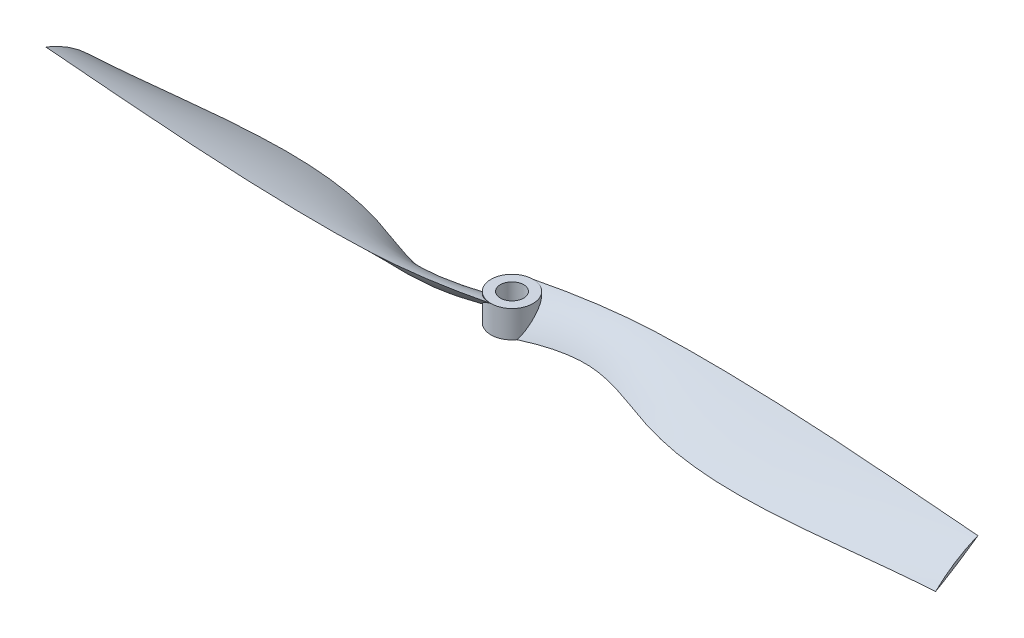
ISO-10303-21;
HEADER;
FILE_DESCRIPTION(('STEP AP214'),'2;1');
FILE_NAME('part.step','',(''),(''),'','','');
FILE_SCHEMA(('AUTOMOTIVE_DESIGN { 1 0 10303 214 1 1 1 1 }'));
ENDSEC;
DATA;
#1=APPLICATION_CONTEXT('core data for automotive mechanical design processes');
#2=APPLICATION_PROTOCOL_DEFINITION('international standard','automotive_design',2000,#1);
#3=PRODUCT_CONTEXT('',#1,'mechanical');
#4=PRODUCT('Part','Part','',(#3));
#5=PRODUCT_RELATED_PRODUCT_CATEGORY('part','',(#4));
#6=PRODUCT_DEFINITION_FORMATION('','',#4);
#7=PRODUCT_DEFINITION_CONTEXT('part definition',#1,'design');
#8=PRODUCT_DEFINITION('design','',#6,#7);
#9=PRODUCT_DEFINITION_SHAPE('','',#8);
#10=(LENGTH_UNIT() NAMED_UNIT(*) SI_UNIT(.MILLI.,.METRE.));
#11=(NAMED_UNIT(*) PLANE_ANGLE_UNIT() SI_UNIT($,.RADIAN.));
#12=(NAMED_UNIT(*) SI_UNIT($,.STERADIAN.) SOLID_ANGLE_UNIT());
#13=UNCERTAINTY_MEASURE_WITH_UNIT(LENGTH_MEASURE(1.E-05),#10,'distance_accuracy_value','');
#14=(GEOMETRIC_REPRESENTATION_CONTEXT(3) GLOBAL_UNCERTAINTY_ASSIGNED_CONTEXT((#13)) GLOBAL_UNIT_ASSIGNED_CONTEXT((#10,
#11,#12)) REPRESENTATION_CONTEXT('',''));
#15=CARTESIAN_POINT('',(0.,0.,0.));
#16=DIRECTION('',(0.,0.,1.));
#17=DIRECTION('',(1.,0.,0.));
#18=AXIS2_PLACEMENT_3D('',#15,#16,#17);
#19=CARTESIAN_POINT('',(0.,3.5,0.));
#20=DIRECTION('',(0.,-1.,0.));
#21=DIRECTION('',(0.,0.,-1.));
#22=AXIS2_PLACEMENT_3D('',#19,#20,#21);
#23=CYLINDRICAL_SURFACE('',#22,5.4);
#24=CARTESIAN_POINT('',(0.,-3.5,0.));
#25=DIRECTION('',(0.,1.,0.));
#26=DIRECTION('',(0.,0.,1.));
#27=AXIS2_PLACEMENT_3D('',#24,#25,#26);
#28=CIRCLE('',#27,5.4);
#29=CARTESIAN_POINT('',(-4.41918488795275,-3.5,-3.10335381903032));
#30=VERTEX_POINT('',#29);
#31=CARTESIAN_POINT('',(4.41918488795275,-3.5,3.10335381903031));
#32=VERTEX_POINT('',#31);
#33=EDGE_CURVE('E46',#30,#32,#28,.T.);
#34=ORIENTED_EDGE('',*,*,#33,.T.);
#35=CARTESIAN_POINT('',(4.41918488795275,-3.5,3.10335381903031));
#36=CARTESIAN_POINT('',(4.4604101205426,-3.43336748555602,3.04463457339622));
#37=CARTESIAN_POINT('',(4.49995846699868,-3.36578298014479,2.98584372432226));
#38=CARTESIAN_POINT('',(4.57593298451117,-3.22908420219905,2.8680604736539));
#39=CARTESIAN_POINT('',(4.61235993128859,-3.15997031514549,2.80906812594708));
#40=CARTESIAN_POINT('',(4.68230721528959,-3.02062581289679,2.69085575102085));
#41=CARTESIAN_POINT('',(4.71583053187688,-2.95039643202226,2.63163602388557));
#42=CARTESIAN_POINT('',(4.78019385419825,-2.80902040625091,2.5128290464834));
#43=CARTESIAN_POINT('',(4.81103366565276,-2.73787369536897,2.45324176994067));
#44=CARTESIAN_POINT('',(4.89975270183403,-2.52342323465822,2.27381888546016));
#45=CARTESIAN_POINT('',(4.95383722043105,-2.37909763224323,2.15331254015121));
#46=CARTESIAN_POINT('',(5.05327102292177,-2.08742649649282,1.90843425378151));
#47=CARTESIAN_POINT('',(5.09850202303885,-1.94006580294201,1.78403276805937));
#48=CARTESIAN_POINT('',(5.17973512502874,-1.64527854687953,1.53226654406895));
#49=CARTESIAN_POINT('',(5.21573546181043,-1.497851977162,1.4049012441302));
#50=CARTESIAN_POINT('',(5.27849757504177,-1.20400289573401,1.14677917638062));
#51=CARTESIAN_POINT('',(5.30525976370166,-1.05758033950984,1.0160225601718));
#52=CARTESIAN_POINT('',(5.34500844938,-0.794713712130156,0.776311392217463));
#53=CARTESIAN_POINT('',(5.35965529157521,-0.677926410094922,0.668007192208229));
#54=CARTESIAN_POINT('',(5.38244064587051,-0.446153633908864,0.44885218603844));
#55=CARTESIAN_POINT('',(5.39058052545951,-0.331167786151019,0.338001919993733));
#56=CARTESIAN_POINT('',(5.39997087143736,-0.103474124334729,0.113662281433424));
#57=CARTESIAN_POINT('',(5.40122053020611,0.00923342113563584,0.000172601110973725));
#58=CARTESIAN_POINT('',(5.3963562325174,0.231372969271267,-0.228943824431259));
#59=CARTESIAN_POINT('',(5.39027191445537,0.34081633653269,-0.344560121026047));
#60=CARTESIAN_POINT('',(5.37023254254186,0.556334416177986,-0.578231204856332));
#61=CARTESIAN_POINT('',(5.35627791271847,0.662409309719615,-0.6962858603905));
#62=CARTESIAN_POINT('',(5.31988434267454,0.870571259905385,-0.934529732756379));
#63=CARTESIAN_POINT('',(5.29744822086196,0.972659628855704,-1.05471822788076));
#64=CARTESIAN_POINT('',(5.24157542923348,1.17913638561014,-1.30516584865122));
#65=CARTESIAN_POINT('',(5.20748874914385,1.28320071605499,-1.43554944052338));
#66=CARTESIAN_POINT('',(5.1280731962804,1.48533803238795,-1.69752561079259));
#67=CARTESIAN_POINT('',(5.08274609500762,1.58341195933674,-1.8291179955388));
#68=CARTESIAN_POINT('',(4.9801185798928,1.77282036498426,-2.09245752188393));
#69=CARTESIAN_POINT('',(4.92282140823335,1.86415665957499,-2.22420461199087));
#70=CARTESIAN_POINT('',(4.79564722930201,2.03944797549757,-2.48656680478274));
#71=CARTESIAN_POINT('',(4.72577003773041,2.12340288866394,-2.6171818908542));
#72=CARTESIAN_POINT('',(4.57239059400412,2.28409217554873,-2.87683399040516));
#73=CARTESIAN_POINT('',(4.48877382725152,2.36075648925887,-3.00584699408273));
#74=CARTESIAN_POINT('',(4.3082829669153,2.50565787314958,-3.25927804537541));
#75=CARTESIAN_POINT('',(4.21140869040465,2.57389482702476,-3.38369602955839));
#76=CARTESIAN_POINT('',(4.00472349038269,2.70179988650986,-3.62595246318709));
#77=CARTESIAN_POINT('',(3.89491692215641,2.76147086199874,-3.74379310812854));
#78=CARTESIAN_POINT('',(3.66299135971123,2.87241100831602,-3.9709993327217));
#79=CARTESIAN_POINT('',(3.54087392623822,2.92368124201475,-4.08036598358731));
#80=CARTESIAN_POINT('',(3.30190582637324,3.01207825343128,-4.27527999114959));
#81=CARTESIAN_POINT('',(3.1864286414865,3.05017703832275,-4.36207653585006));
#82=CARTESIAN_POINT('',(2.94769340457762,3.12070261273306,-4.52682366183866));
#83=CARTESIAN_POINT('',(2.82443561765341,3.15312959535774,-4.60477454426017));
#84=CARTESIAN_POINT('',(2.57100675080269,3.2127862068235,-4.75092968656728));
#85=CARTESIAN_POINT('',(2.44083280781373,3.24001366146174,-4.81912986617584));
#86=CARTESIAN_POINT('',(2.17461880015893,3.28976437303129,-4.94496796488434));
#87=CARTESIAN_POINT('',(2.03857891213785,3.31228777149951,-5.00260620176846));
#88=CARTESIAN_POINT('',(1.76582131322648,3.35254003145319,-5.10514123502791));
#89=CARTESIAN_POINT('',(1.62924528877539,3.37039203459072,-5.15036725871229));
#90=CARTESIAN_POINT('',(1.35254061164642,3.40261652940536,-5.22985204745642));
#91=CARTESIAN_POINT('',(1.21241205799715,3.41698911795541,-5.26411111786373));
#92=CARTESIAN_POINT('',(0.929871040065975,3.44265063570142,-5.32128557677752));
#93=CARTESIAN_POINT('',(0.787463421555018,3.45394537247775,-5.34422239650218));
#94=CARTESIAN_POINT('',(0.501144485650809,3.47384998832177,-5.37862655698535));
#95=CARTESIAN_POINT('',(0.357234118489247,3.48246146904569,-5.39010074893402));
#96=CARTESIAN_POINT('',(0.177579717990571,3.49171214991471,-5.39719651976856));
#97=CARTESIAN_POINT('',(0.142059328174401,3.49346826416285,-5.39824816313132));
#98=CARTESIAN_POINT('',(0.0710279621018893,3.4968388349927,-5.39964949380082));
#99=CARTESIAN_POINT('',(0.0355170030915233,3.49845340957628,-5.39999977126331));
#100=CARTESIAN_POINT('',(0.,3.5,-5.4));
#101=B_SPLINE_CURVE_WITH_KNOTS('',3,(#35,#36,#37,#38,#39,#40,#41,#42,#43,#44,#45,#46,#47,#48,
#49,#50,#51,#52,#53,#54,#55,#56,#57,#58,#59,#60,#61,#62,#63,#64,#65,#66,#67,#68,#69,#70,#71,#72,
#73,#74,#75,#76,#77,#78,#79,#80,#81,#82,#83,#84,#85,#86,#87,#88,#89,#90,#91,#92,#93,#94,#95,#96,
#97,#98,#99,#100),.UNSPECIFIED.,.F.,.F.,(4,2,2,2,2,2,2,2,2,2,2,2,2,2,2,2,2,2,2,2,2,2,2,2,2,2,2,
2,2,2,2,2,4),(0.,0.29370396488851,0.587334726359795,0.880660538229285,1.17400756856857,
1.76065341963551,2.3546697046551,2.94879949313682,3.54290276785765,4.02260163666692,
4.50219966649728,4.98185391002378,5.45957623483793,5.93727282390774,6.41481081327993,
6.92516556422428,7.43543993383626,7.94557627061862,8.45572008160494,8.9703542016417,
9.48499542331291,9.99946381914954,10.5138670735807,10.9615072373095,11.4091321574246,
11.8569438457403,12.3047420582359,12.7391613454514,13.1735685362886,13.6071502799418,
14.0404727173076,14.1472065870339,14.2538506090473),.UNSPECIFIED.);
#102=CARTESIAN_POINT('',(0.,3.5,-5.4));
#103=VERTEX_POINT('',#102);
#104=EDGE_CURVE('E59',#32,#103,#101,.T.);
#105=ORIENTED_EDGE('',*,*,#104,.T.);
#106=CARTESIAN_POINT('',(0.,3.5,0.));
#107=DIRECTION('',(0.,1.,0.));
#108=DIRECTION('',(0.,0.,1.));
#109=AXIS2_PLACEMENT_3D('',#106,#107,#108);
#110=CIRCLE('',#109,5.4);
#111=CARTESIAN_POINT('',(0.,3.5,5.4));
#112=VERTEX_POINT('',#111);
#113=EDGE_CURVE('E11',#112,#103,#110,.T.);
#114=ORIENTED_EDGE('',*,*,#113,.F.);
#115=CARTESIAN_POINT('',(0.,3.5,5.4));
#116=CARTESIAN_POINT('',(-0.0707902295039716,3.48091702945953,5.40000109805365));
#117=CARTESIAN_POINT('',(-0.141167622617572,3.46037823160796,5.39860778788969));
#118=CARTESIAN_POINT('',(-0.280931878348902,3.41654901950545,5.39314054188027));
#119=CARTESIAN_POINT('',(-0.350319045091694,3.3932594713964,5.38906744799466));
#120=CARTESIAN_POINT('',(-0.55643275534332,3.31962155093008,5.37301902993027));
#121=CARTESIAN_POINT('',(-0.691505479413642,3.2653963793861,5.35721334184325));
#122=CARTESIAN_POINT('',(-0.954339808268309,3.14889621106557,5.31664239584639));
#123=CARTESIAN_POINT('',(-1.08217767545191,3.08674557784695,5.29200668925314));
#124=CARTESIAN_POINT('',(-1.33224279543914,2.95513606909263,5.23465345548202));
#125=CARTESIAN_POINT('',(-1.45446563898028,2.88567158654987,5.20192970149599));
#126=CARTESIAN_POINT('',(-1.73027499621123,2.71813264568398,5.11790298694128));
#127=CARTESIAN_POINT('',(-1.88174962489398,2.6178937236479,5.06398876230656));
#128=CARTESIAN_POINT('',(-2.1746890016931,2.40963309035633,4.94527223319639));
#129=CARTESIAN_POINT('',(-2.31615190239814,2.30160995010349,4.8804679266375));
#130=CARTESIAN_POINT('',(-2.59044115098279,2.07904362874885,4.74062067335338));
#131=CARTESIAN_POINT('',(-2.7231966296543,1.96445847693813,4.66550619167144));
#132=CARTESIAN_POINT('',(-2.97934948615688,1.73123315179934,4.50624215839688));
#133=CARTESIAN_POINT('',(-3.10274650031725,1.61259282114631,4.42209225599373));
#134=CARTESIAN_POINT('',(-3.38127798605231,1.33160672809383,4.21503758052774));
#135=CARTESIAN_POINT('',(-3.53282078563181,1.16819951072278,4.08872574977455));
#136=CARTESIAN_POINT('',(-3.82025605507577,0.839467722250604,3.82153726591543));
#137=CARTESIAN_POINT('',(-3.95614310113484,0.674142508378459,3.68065559709503));
#138=CARTESIAN_POINT('',(-4.21190488724998,0.344339241063858,3.38496484520181));
#139=CARTESIAN_POINT('',(-4.3318108798632,0.179860157382653,3.23018396648045));
#140=CARTESIAN_POINT('',(-4.55522959925532,-0.146383314491664,2.90663210844121));
#141=CARTESIAN_POINT('',(-4.65874773180061,-0.308148582067612,2.73786577052661));
#142=CARTESIAN_POINT('',(-4.82965740623026,-0.595847011263494,2.42078599363901));
#143=CARTESIAN_POINT('',(-4.90015738425229,-0.722616488700892,2.27490128067798));
#144=CARTESIAN_POINT('',(-5.02876920882638,-0.972045346569741,1.97438297784407));
#145=CARTESIAN_POINT('',(-5.08688151747308,-1.09470488016966,1.81974971458893));
#146=CARTESIAN_POINT('',(-5.1894730940954,-1.33469060351921,1.50237851220533));
#147=CARTESIAN_POINT('',(-5.23397094883835,-1.45202387661838,1.33965197847006));
#148=CARTESIAN_POINT('',(-5.30808784670011,-1.68048424053199,1.00662088720331));
#149=CARTESIAN_POINT('',(-5.33770982280593,-1.79161255089796,0.836317830702867));
#150=CARTESIAN_POINT('',(-5.37670042602779,-1.98694681492127,0.521046962638232));
#151=CARTESIAN_POINT('',(-5.38878603645914,-2.07235412814554,0.377156443973048));
#152=CARTESIAN_POINT('',(-5.40128428645354,-2.23785078255383,0.0858580594322358));
#153=CARTESIAN_POINT('',(-5.40169887655849,-2.31794101013392,-0.0615492145773195));
#154=CARTESIAN_POINT('',(-5.39011096712508,-2.47239269525534,-0.358974627887704));
#155=CARTESIAN_POINT('',(-5.37810171725548,-2.54675101483997,-0.508994142950934));
#156=CARTESIAN_POINT('',(-5.34100796798822,-2.68929315131044,-0.810357044734655));
#157=CARTESIAN_POINT('',(-5.31592384974578,-2.75747714812056,-0.96170039273666));
#158=CARTESIAN_POINT('',(-5.25194706015455,-2.88782998309472,-1.26542907461458));
#159=CARTESIAN_POINT('',(-5.21295528850531,-2.94995146758674,-1.4178139815267));
#160=CARTESIAN_POINT('',(-5.12088341065518,-3.06737523721989,-1.72094018891239));
#161=CARTESIAN_POINT('',(-5.06780511261347,-3.12267839623401,-1.87168169775046));
#162=CARTESIAN_POINT('',(-4.94762682821785,-3.22620858701941,-2.16949673958286));
#163=CARTESIAN_POINT('',(-4.88056148246025,-3.27445260850568,-2.31657834790367));
#164=CARTESIAN_POINT('',(-4.73252287007731,-3.36394839581921,-2.60567817568683));
#165=CARTESIAN_POINT('',(-4.65156162019338,-3.4052061424228,-2.74770064305268));
#166=CARTESIAN_POINT('',(-4.54069573038565,-3.45297176619784,-2.9230071474527));
#167=CARTESIAN_POINT('',(-4.51703167385927,-3.46272093378846,-2.959445824191));
#168=CARTESIAN_POINT('',(-4.46879366477128,-3.48172623526797,-3.03179302854292));
#169=CARTESIAN_POINT('',(-4.44422061433826,-3.49098283686919,-3.06770203480042));
#170=CARTESIAN_POINT('',(-4.41918488795276,-3.5,-3.10335381903031));
#171=B_SPLINE_CURVE_WITH_KNOTS('',3,(#115,#116,#117,#118,#119,#120,#121,#122,#123,#124,#125,
#126,#127,#128,#129,#130,#131,#132,#133,#134,#135,#136,#137,#138,#139,#140,#141,#142,#143,#144,
#145,#146,#147,#148,#149,#150,#151,#152,#153,#154,#155,#156,#157,#158,#159,#160,#161,#162,#163,
#164,#165,#166,#167,#168,#169,#170),.UNSPECIFIED.,.F.,.F.,(4,2,2,2,2,2,2,2,2,2,2,2,2,2,2,2,2,2,
2,2,2,2,2,2,2,2,2,4),(0.,0.219888164039623,0.439707274502231,0.878126607318659,1.31036054259655,
1.74292828741465,2.31045417849728,2.87808452056099,3.44987361239516,4.02168491262711,
4.78919537509148,5.55697094065114,6.32322229529749,7.08922036209728,7.70585384939438,
8.32246433051497,8.93822920532184,9.55387262578136,10.0566810608454,10.5594054625764,
11.0624031565791,11.5653861881417,12.0720273238717,12.5786034581183,13.0839395854746,
13.5888408957315,13.7224177051442,13.8558653274527),.UNSPECIFIED.);
#172=EDGE_CURVE('E179',#112,#30,#171,.T.);
#173=ORIENTED_EDGE('',*,*,#172,.T.);
#174=EDGE_LOOP('',(#34,#105,#114,#173));
#175=FACE_BOUND('',#174,.T.);
#176=ADVANCED_FACE('F41',(#175),#23,.T.);
#177=CARTESIAN_POINT('',(0.,3.5,0.));
#178=DIRECTION('',(0.,1.,0.));
#179=DIRECTION('',(0.,0.,1.));
#180=AXIS2_PLACEMENT_3D('',#177,#178,#179);
#181=PLANE('',#180);
#182=ORIENTED_EDGE('',*,*,#113,.T.);
#183=EDGE_CURVE('E52',#103,#112,#110,.T.);
#184=ORIENTED_EDGE('',*,*,#183,.T.);
#185=EDGE_LOOP('',(#182,#184));
#186=FACE_BOUND('',#185,.T.);
#187=CARTESIAN_POINT('',(0.,3.5,0.));
#188=DIRECTION('',(0.,1.,0.));
#189=DIRECTION('',(0.,0.,1.));
#190=AXIS2_PLACEMENT_3D('',#187,#188,#189);
#191=CIRCLE('',#190,3.);
#192=CARTESIAN_POINT('',(0.,3.5,3.));
#193=VERTEX_POINT('',#192);
#194=EDGE_CURVE('E174',#193,#193,#191,.T.);
#195=ORIENTED_EDGE('',*,*,#194,.F.);
#196=EDGE_LOOP('',(#195));
#197=FACE_BOUND('',#196,.T.);
#198=ADVANCED_FACE('F234',(#186,#197),#181,.T.);
#199=CARTESIAN_POINT('',(0.,-3.5,0.));
#200=DIRECTION('',(0.,1.,0.));
#201=DIRECTION('',(0.,0.,1.));
#202=AXIS2_PLACEMENT_3D('',#199,#200,#201);
#203=PLANE('',#202);
#204=ORIENTED_EDGE('',*,*,#33,.F.);
#205=EDGE_CURVE('E67',#32,#30,#28,.T.);
#206=ORIENTED_EDGE('',*,*,#205,.F.);
#207=EDGE_LOOP('',(#204,#206));
#208=FACE_BOUND('',#207,.T.);
#209=CARTESIAN_POINT('',(0.,-3.5,0.));
#210=DIRECTION('',(0.,1.,0.));
#211=DIRECTION('',(0.,0.,1.));
#212=AXIS2_PLACEMENT_3D('',#209,#210,#211);
#213=CIRCLE('',#212,3.);
#214=CARTESIAN_POINT('',(0.,-3.5,3.));
#215=VERTEX_POINT('',#214);
#216=EDGE_CURVE('E184',#215,#215,#213,.T.);
#217=ORIENTED_EDGE('',*,*,#216,.T.);
#218=EDGE_LOOP('',(#217));
#219=FACE_BOUND('',#218,.T.);
#220=ADVANCED_FACE('F170',(#208,#219),#203,.F.);
#221=ORIENTED_EDGE('',*,*,#183,.F.);
#222=CARTESIAN_POINT('',(0.,3.5,-5.4));
#223=CARTESIAN_POINT('',(0.0707902295039716,3.48091702945953,-5.40000109805365));
#224=CARTESIAN_POINT('',(0.141167622617572,3.46037823160796,-5.39860778788969));
#225=CARTESIAN_POINT('',(0.280931878348902,3.41654901950545,-5.39314054188027));
#226=CARTESIAN_POINT('',(0.350319045091694,3.3932594713964,-5.38906744799466));
#227=CARTESIAN_POINT('',(0.55643275534332,3.31962155093008,-5.37301902993027));
#228=CARTESIAN_POINT('',(0.691505479413642,3.2653963793861,-5.35721334184325));
#229=CARTESIAN_POINT('',(0.954339808268309,3.14889621106557,-5.31664239584639));
#230=CARTESIAN_POINT('',(1.08217767545191,3.08674557784695,-5.29200668925314));
#231=CARTESIAN_POINT('',(1.33224279543914,2.95513606909263,-5.23465345548202));
#232=CARTESIAN_POINT('',(1.45446563898028,2.88567158654987,-5.20192970149599));
#233=CARTESIAN_POINT('',(1.73027499621123,2.71813264568398,-5.11790298694128));
#234=CARTESIAN_POINT('',(1.88174962489398,2.6178937236479,-5.06398876230656));
#235=CARTESIAN_POINT('',(2.1746890016931,2.40963309035633,-4.94527223319639));
#236=CARTESIAN_POINT('',(2.31615190239814,2.30160995010349,-4.8804679266375));
#237=CARTESIAN_POINT('',(2.59044115098279,2.07904362874885,-4.74062067335338));
#238=CARTESIAN_POINT('',(2.7231966296543,1.96445847693813,-4.66550619167144));
#239=CARTESIAN_POINT('',(2.97934948615688,1.73123315179934,-4.50624215839688));
#240=CARTESIAN_POINT('',(3.10274650031725,1.61259282114631,-4.42209225599373));
#241=CARTESIAN_POINT('',(3.38127798605231,1.33160672809383,-4.21503758052774));
#242=CARTESIAN_POINT('',(3.53282078563181,1.16819951072278,-4.08872574977455));
#243=CARTESIAN_POINT('',(3.82025605507577,0.839467722250604,-3.82153726591543));
#244=CARTESIAN_POINT('',(3.95614310113484,0.674142508378459,-3.68065559709503));
#245=CARTESIAN_POINT('',(4.21190488724998,0.344339241063858,-3.38496484520181));
#246=CARTESIAN_POINT('',(4.3318108798632,0.179860157382653,-3.23018396648045));
#247=CARTESIAN_POINT('',(4.55522959925532,-0.146383314491664,-2.90663210844121));
#248=CARTESIAN_POINT('',(4.65874773180061,-0.308148582067612,-2.73786577052661));
#249=CARTESIAN_POINT('',(4.82965740623026,-0.595847011263494,-2.42078599363901));
#250=CARTESIAN_POINT('',(4.90015738425229,-0.722616488700892,-2.27490128067798));
#251=CARTESIAN_POINT('',(5.02876920882638,-0.972045346569741,-1.97438297784407));
#252=CARTESIAN_POINT('',(5.08688151747308,-1.09470488016966,-1.81974971458893));
#253=CARTESIAN_POINT('',(5.1894730940954,-1.33469060351921,-1.50237851220533));
#254=CARTESIAN_POINT('',(5.23397094883835,-1.45202387661838,-1.33965197847006));
#255=CARTESIAN_POINT('',(5.30808784670011,-1.68048424053199,-1.00662088720331));
#256=CARTESIAN_POINT('',(5.33770982280593,-1.79161255089796,-0.836317830702867));
#257=CARTESIAN_POINT('',(5.37670042602779,-1.98694681492127,-0.521046962638232));
#258=CARTESIAN_POINT('',(5.38878603645914,-2.07235412814554,-0.377156443973048));
#259=CARTESIAN_POINT('',(5.40128428645354,-2.23785078255383,-0.0858580594322358));
#260=CARTESIAN_POINT('',(5.40169887655849,-2.31794101013392,0.0615492145773195));
#261=CARTESIAN_POINT('',(5.39011096712508,-2.47239269525534,0.358974627887704));
#262=CARTESIAN_POINT('',(5.37810171725548,-2.54675101483997,0.508994142950934));
#263=CARTESIAN_POINT('',(5.34100796798822,-2.68929315131044,0.810357044734655));
#264=CARTESIAN_POINT('',(5.31592384974578,-2.75747714812056,0.96170039273666));
#265=CARTESIAN_POINT('',(5.25194706015455,-2.88782998309472,1.26542907461458));
#266=CARTESIAN_POINT('',(5.21295528850531,-2.94995146758674,1.4178139815267));
#267=CARTESIAN_POINT('',(5.12088341065518,-3.06737523721989,1.72094018891239));
#268=CARTESIAN_POINT('',(5.06780511261347,-3.12267839623401,1.87168169775046));
#269=CARTESIAN_POINT('',(4.94762682821785,-3.22620858701941,2.16949673958286));
#270=CARTESIAN_POINT('',(4.88056148246025,-3.27445260850568,2.31657834790367));
#271=CARTESIAN_POINT('',(4.73252287007731,-3.36394839581921,2.60567817568683));
#272=CARTESIAN_POINT('',(4.65156162019338,-3.4052061424228,2.74770064305268));
#273=CARTESIAN_POINT('',(4.54069573038565,-3.45297176619784,2.9230071474527));
#274=CARTESIAN_POINT('',(4.51703167385927,-3.46272093378846,2.959445824191));
#275=CARTESIAN_POINT('',(4.46879366477128,-3.48172623526797,3.03179302854292));
#276=CARTESIAN_POINT('',(4.44422061433826,-3.49098283686919,3.06770203480042));
#277=CARTESIAN_POINT('',(4.41918488795276,-3.5,3.10335381903031));
#278=B_SPLINE_CURVE_WITH_KNOTS('',3,(#222,#223,#224,#225,#226,#227,#228,#229,#230,#231,#232,
#233,#234,#235,#236,#237,#238,#239,#240,#241,#242,#243,#244,#245,#246,#247,#248,#249,#250,#251,
#252,#253,#254,#255,#256,#257,#258,#259,#260,#261,#262,#263,#264,#265,#266,#267,#268,#269,#270,
#271,#272,#273,#274,#275,#276,#277),.UNSPECIFIED.,.F.,.F.,(4,2,2,2,2,2,2,2,2,2,2,2,2,2,2,2,2,2,
2,2,2,2,2,2,2,2,2,4),(0.,0.219888164039623,0.439707274502231,0.878126607318659,1.31036054259655,
1.74292828741465,2.31045417849728,2.87808452056099,3.44987361239516,4.02168491262711,
4.78919537509148,5.55697094065114,6.32322229529749,7.08922036209728,7.70585384939438,
8.32246433051497,8.93822920532184,9.55387262578136,10.0566810608454,10.5594054625764,
11.0624031565791,11.5653861881417,12.0720273238717,12.5786034581183,13.0839395854746,
13.5888408957315,13.7224177051442,13.8558653274527),.UNSPECIFIED.);
#279=EDGE_CURVE('E95',#103,#32,#278,.T.);
#280=ORIENTED_EDGE('',*,*,#279,.T.);
#281=ORIENTED_EDGE('',*,*,#205,.T.);
#282=CARTESIAN_POINT('',(-4.41918488795275,-3.5,-3.10335381903031));
#283=CARTESIAN_POINT('',(-4.4604101205426,-3.43336748555602,-3.04463457339622));
#284=CARTESIAN_POINT('',(-4.49995846699868,-3.36578298014479,-2.98584372432226));
#285=CARTESIAN_POINT('',(-4.57593298451117,-3.22908420219905,-2.8680604736539));
#286=CARTESIAN_POINT('',(-4.61235993128859,-3.15997031514549,-2.80906812594708));
#287=CARTESIAN_POINT('',(-4.68230721528959,-3.02062581289679,-2.69085575102085));
#288=CARTESIAN_POINT('',(-4.71583053187688,-2.95039643202226,-2.63163602388557));
#289=CARTESIAN_POINT('',(-4.78019385419825,-2.80902040625091,-2.5128290464834));
#290=CARTESIAN_POINT('',(-4.81103366565276,-2.73787369536897,-2.45324176994067));
#291=CARTESIAN_POINT('',(-4.89975270183403,-2.52342323465822,-2.27381888546016));
#292=CARTESIAN_POINT('',(-4.95383722043105,-2.37909763224323,-2.15331254015121));
#293=CARTESIAN_POINT('',(-5.05327102292177,-2.08742649649282,-1.90843425378151));
#294=CARTESIAN_POINT('',(-5.09850202303885,-1.94006580294201,-1.78403276805937));
#295=CARTESIAN_POINT('',(-5.17973512502874,-1.64527854687953,-1.53226654406895));
#296=CARTESIAN_POINT('',(-5.21573546181043,-1.497851977162,-1.4049012441302));
#297=CARTESIAN_POINT('',(-5.27849757504177,-1.20400289573401,-1.14677917638062));
#298=CARTESIAN_POINT('',(-5.30525976370166,-1.05758033950984,-1.0160225601718));
#299=CARTESIAN_POINT('',(-5.34500844938,-0.794713712130156,-0.776311392217463));
#300=CARTESIAN_POINT('',(-5.35965529157521,-0.677926410094922,-0.668007192208229));
#301=CARTESIAN_POINT('',(-5.38244064587051,-0.446153633908864,-0.44885218603844));
#302=CARTESIAN_POINT('',(-5.39058052545951,-0.331167786151019,-0.338001919993733));
#303=CARTESIAN_POINT('',(-5.39997087143736,-0.103474124334729,-0.113662281433424));
#304=CARTESIAN_POINT('',(-5.40122053020611,0.00923342113563584,-0.000172601110973725));
#305=CARTESIAN_POINT('',(-5.3963562325174,0.231372969271267,0.228943824431259));
#306=CARTESIAN_POINT('',(-5.39027191445537,0.34081633653269,0.344560121026047));
#307=CARTESIAN_POINT('',(-5.37023254254186,0.556334416177986,0.578231204856332));
#308=CARTESIAN_POINT('',(-5.35627791271847,0.662409309719615,0.6962858603905));
#309=CARTESIAN_POINT('',(-5.31988434267454,0.870571259905385,0.934529732756379));
#310=CARTESIAN_POINT('',(-5.29744822086196,0.972659628855704,1.05471822788076));
#311=CARTESIAN_POINT('',(-5.24157542923348,1.17913638561014,1.30516584865122));
#312=CARTESIAN_POINT('',(-5.20748874914385,1.28320071605499,1.43554944052338));
#313=CARTESIAN_POINT('',(-5.1280731962804,1.48533803238795,1.69752561079259));
#314=CARTESIAN_POINT('',(-5.08274609500762,1.58341195933674,1.8291179955388));
#315=CARTESIAN_POINT('',(-4.9801185798928,1.77282036498426,2.09245752188393));
#316=CARTESIAN_POINT('',(-4.92282140823335,1.86415665957499,2.22420461199087));
#317=CARTESIAN_POINT('',(-4.79564722930201,2.03944797549757,2.48656680478274));
#318=CARTESIAN_POINT('',(-4.72577003773041,2.12340288866394,2.6171818908542));
#319=CARTESIAN_POINT('',(-4.57239059400412,2.28409217554873,2.87683399040516));
#320=CARTESIAN_POINT('',(-4.48877382725152,2.36075648925887,3.00584699408273));
#321=CARTESIAN_POINT('',(-4.3082829669153,2.50565787314958,3.25927804537541));
#322=CARTESIAN_POINT('',(-4.21140869040465,2.57389482702476,3.38369602955839));
#323=CARTESIAN_POINT('',(-4.00472349038269,2.70179988650986,3.62595246318709));
#324=CARTESIAN_POINT('',(-3.89491692215641,2.76147086199874,3.74379310812854));
#325=CARTESIAN_POINT('',(-3.66299135971123,2.87241100831602,3.9709993327217));
#326=CARTESIAN_POINT('',(-3.54087392623822,2.92368124201475,4.08036598358731));
#327=CARTESIAN_POINT('',(-3.30190582637324,3.01207825343128,4.27527999114959));
#328=CARTESIAN_POINT('',(-3.1864286414865,3.05017703832275,4.36207653585006));
#329=CARTESIAN_POINT('',(-2.94769340457762,3.12070261273306,4.52682366183866));
#330=CARTESIAN_POINT('',(-2.82443561765341,3.15312959535774,4.60477454426017));
#331=CARTESIAN_POINT('',(-2.57100675080269,3.2127862068235,4.75092968656728));
#332=CARTESIAN_POINT('',(-2.44083280781373,3.24001366146174,4.81912986617584));
#333=CARTESIAN_POINT('',(-2.17461880015893,3.28976437303129,4.94496796488434));
#334=CARTESIAN_POINT('',(-2.03857891213785,3.31228777149951,5.00260620176846));
#335=CARTESIAN_POINT('',(-1.76582131322648,3.35254003145319,5.10514123502791));
#336=CARTESIAN_POINT('',(-1.62924528877539,3.37039203459072,5.15036725871229));
#337=CARTESIAN_POINT('',(-1.35254061164642,3.40261652940536,5.22985204745642));
#338=CARTESIAN_POINT('',(-1.21241205799715,3.41698911795541,5.26411111786373));
#339=CARTESIAN_POINT('',(-0.929871040065975,3.44265063570142,5.32128557677752));
#340=CARTESIAN_POINT('',(-0.787463421555018,3.45394537247775,5.34422239650218));
#341=CARTESIAN_POINT('',(-0.501144485650809,3.47384998832177,5.37862655698535));
#342=CARTESIAN_POINT('',(-0.357234118489247,3.48246146904569,5.39010074893402));
#343=CARTESIAN_POINT('',(-0.177579717990571,3.49171214991471,5.39719651976856));
#344=CARTESIAN_POINT('',(-0.142059328174401,3.49346826416285,5.39824816313132));
#345=CARTESIAN_POINT('',(-0.0710279621018893,3.4968388349927,5.39964949380082));
#346=CARTESIAN_POINT('',(-0.0355170030915233,3.49845340957628,5.39999977126331));
#347=CARTESIAN_POINT('',(0.,3.5,5.4));
#348=B_SPLINE_CURVE_WITH_KNOTS('',3,(#282,#283,#284,#285,#286,#287,#288,#289,#290,#291,#292,
#293,#294,#295,#296,#297,#298,#299,#300,#301,#302,#303,#304,#305,#306,#307,#308,#309,#310,#311,
#312,#313,#314,#315,#316,#317,#318,#319,#320,#321,#322,#323,#324,#325,#326,#327,#328,#329,#330,
#331,#332,#333,#334,#335,#336,#337,#338,#339,#340,#341,#342,#343,#344,#345,#346,#347),
.UNSPECIFIED.,.F.,.F.,(4,2,2,2,2,2,2,2,2,2,2,2,2,2,2,2,2,2,2,2,2,2,2,2,2,2,2,2,2,2,2,2,4),(0.,
0.29370396488851,0.587334726359795,0.880660538229285,1.17400756856857,1.76065341963551,
2.3546697046551,2.94879949313682,3.54290276785765,4.02260163666692,4.50219966649728,
4.98185391002378,5.45957623483793,5.93727282390774,6.41481081327993,6.92516556422428,
7.43543993383626,7.94557627061862,8.45572008160494,8.9703542016417,9.48499542331291,
9.99946381914954,10.5138670735807,10.9615072373095,11.4091321574246,11.8569438457403,
12.3047420582359,12.7391613454514,13.1735685362886,13.6071502799418,14.0404727173076,
14.1472065870339,14.2538506090473),.UNSPECIFIED.);
#349=EDGE_CURVE('E188',#30,#112,#348,.T.);
#350=ORIENTED_EDGE('',*,*,#349,.T.);
#351=EDGE_LOOP('',(#221,#280,#281,#350));
#352=FACE_BOUND('',#351,.T.);
#353=ADVANCED_FACE('F43',(#352),#23,.T.);
#354=CARTESIAN_POINT('',(0.,3.5,0.));
#355=DIRECTION('',(0.,-1.,0.));
#356=DIRECTION('',(0.,0.,-1.));
#357=AXIS2_PLACEMENT_3D('',#354,#355,#356);
#358=CYLINDRICAL_SURFACE('',#357,3.);
#359=ORIENTED_EDGE('',*,*,#194,.T.);
#360=EDGE_LOOP('',(#359));
#361=FACE_BOUND('',#360,.T.);
#362=ORIENTED_EDGE('',*,*,#216,.F.);
#363=EDGE_LOOP('',(#362));
#364=FACE_BOUND('',#363,.T.);
#365=ADVANCED_FACE('F210',(#361,#364),#358,.F.);
#366=CARTESIAN_POINT('',(0.,3.5,5.4));
#367=CARTESIAN_POINT('',(-6.61813777905888,3.49024504946924,7.02486724950979));
#368=CARTESIAN_POINT('',(-19.8753926223661,3.47632460698663,9.44932959621208));
#369=CARTESIAN_POINT('',(-57.7363724590993,3.48391567950975,10.2123636513944));
#370=CARTESIAN_POINT('',(-89.5513739012525,3.49210198903606,7.40613713915575));
#371=CARTESIAN_POINT('',(-114.3,3.5,5.51203801882395));
#372=CARTESIAN_POINT('',(0.,2.73657788312784,0.944838094371212));
#373=CARTESIAN_POINT('',(-6.63431407492814,2.730074582774,3.2968593607339));
#374=CARTESIAN_POINT('',(-19.8676862358598,2.4934081493926,6.21573153745612));
#375=CARTESIAN_POINT('',(-57.7488353472206,1.77610864958191,2.23430840700327));
#376=CARTESIAN_POINT('',(-89.5152074835688,1.92053330281317,2.19505513909873));
#377=CARTESIAN_POINT('',(-114.3,1.9257986434558,1.43033815814246));
#378=CARTESIAN_POINT('',(0.,0.403244549794503,-2.65516190562879));
#379=CARTESIAN_POINT('',(-6.65049037079741,0.399992899617584,0.424013377586792));
#380=CARTESIAN_POINT('',(-19.8599798493536,0.167966613730387,4.08905320762206));
#381=CARTESIAN_POINT('',(-57.7612982353419,-0.551863243588009,-6.12155940107417));
#382=CARTESIAN_POINT('',(-89.4790410658852,-0.410167360198852,-2.57167300655146));
#383=CARTESIAN_POINT('',(-114.3,-0.407534689877537,-2.20700784813219));
#384=CARTESIAN_POINT('',(0.,-3.5,-5.4));
#385=CARTESIAN_POINT('',(-6.66666666666667,-3.5,-1.59367069993153));
#386=CARTESIAN_POINT('',(-19.8522734628474,-3.5,3.06929460670992));
#387=CARTESIAN_POINT('',(-57.7737611234632,-3.5,-14.855239772838));
#388=CARTESIAN_POINT('',(-89.4428746482016,-3.5,-6.8940472977948));
#389=CARTESIAN_POINT('',(-114.3,-3.5,-5.4));
#390=B_SPLINE_SURFACE_WITH_KNOTS('',3,3,((#366,#367,#368,#369,#370,#371),(#372,#373,#374,#375,
#376,#377),(#378,#379,#380,#381,#382,#383),(#384,#385,#386,#387,#388,#389)),.UNSPECIFIED.,.F.,
.F.,.F.,(4,4),(4,1,1,4),(0.,1.),(0.,0.178368701761946,0.35452479282494,1.),.UNSPECIFIED.);
#391=CARTESIAN_POINT('',(0.,-3.5,-5.4));
#392=CARTESIAN_POINT('',(-6.66666666666667,-3.5,-1.59367069993153));
#393=CARTESIAN_POINT('',(-19.8522734628474,-3.5,3.06929460670992));
#394=CARTESIAN_POINT('',(-57.7737611234632,-3.5,-14.855239772838));
#395=CARTESIAN_POINT('',(-89.4428746482016,-3.5,-6.8940472977948));
#396=CARTESIAN_POINT('',(-114.3,-3.5,-5.4));
#397=B_SPLINE_CURVE_WITH_KNOTS('',3,(#391,#392,#393,#394,#395,#396),.UNSPECIFIED.,.F.,.F.,(4,1,
1,4),(0.,0.178368701761946,0.35452479282494,1.),.UNSPECIFIED.);
#398=CARTESIAN_POINT('',(-114.3,-3.5,-5.4));
#399=VERTEX_POINT('',#398);
#400=EDGE_CURVE('E129',#30,#399,#397,.T.);
#401=CARTESIAN_POINT('',(-114.3,-3.5,-5.4));
#402=CARTESIAN_POINT('',(-114.3,1.13869796518369,-0.610511772198288));
#403=CARTESIAN_POINT('',(-114.3,3.5,5.51203801882395));
#404=B_SPLINE_CURVE_WITH_KNOTS('',2,(#401,#402,#403),.UNSPECIFIED.,.F.,.F.,(3,3),(0.,1.),.UNSPECIFIED.);
#405=CARTESIAN_POINT('',(-114.3,3.5,5.51203801882395));
#406=VERTEX_POINT('',#405);
#407=EDGE_CURVE('E318',#399,#406,#404,.T.);
#408=CARTESIAN_POINT('',(0.,3.5,5.4));
#409=CARTESIAN_POINT('',(-6.61813777905888,3.49024504946924,7.02486724950979));
#410=CARTESIAN_POINT('',(-19.8753926223661,3.47632460698663,9.44932959621208));
#411=CARTESIAN_POINT('',(-57.7363724590993,3.48391567950975,10.2123636513944));
#412=CARTESIAN_POINT('',(-89.5513739012525,3.49210198903606,7.40613713915575));
#413=CARTESIAN_POINT('',(-114.3,3.5,5.51203801882395));
#414=B_SPLINE_CURVE_WITH_KNOTS('',3,(#408,#409,#410,#411,#412,#413),.UNSPECIFIED.,.F.,.F.,(4,1,
1,4),(0.,0.178368701761946,0.35452479282494,1.),.UNSPECIFIED.);
#415=EDGE_CURVE('E128',#406,#112,#414,.F.);
#416=ORIENTED_EDGE('',*,*,#349,.F.);
#417=ORIENTED_EDGE('',*,*,#400,.T.);
#418=ORIENTED_EDGE('',*,*,#407,.T.);
#419=ORIENTED_EDGE('',*,*,#415,.T.);
#420=EDGE_LOOP('',(#416,#417,#418,#419));
#421=FACE_BOUND('',#420,.T.);
#422=ADVANCED_FACE('F204',(#421),#390,.T.);
#423=CARTESIAN_POINT('',(0.,-3.5,-5.4));
#424=CARTESIAN_POINT('',(-6.66666666666667,-3.5,-1.59367069993153));
#425=CARTESIAN_POINT('',(-19.8522734628474,-3.5,3.06929460670992));
#426=CARTESIAN_POINT('',(-57.7737611234632,-3.5,-14.855239772838));
#427=CARTESIAN_POINT('',(-89.4428746482016,-3.5,-6.8940472977948));
#428=CARTESIAN_POINT('',(-114.3,-3.5,-5.4));
#429=CARTESIAN_POINT('',(0.,-2.02393758993659,-1.12146957636275));
#430=CARTESIAN_POINT('',(-6.65049037079741,-2.02718924011351,1.95770570685283));
#431=CARTESIAN_POINT('',(-19.8599798493536,-2.28881513648397,6.36046465139412));
#432=CARTESIAN_POINT('',(-57.7612982353419,-0.407008392996108,-7.59141628626431));
#433=CARTESIAN_POINT('',(-89.4790410658852,-1.33866659829734,-2.01775388582852));
#434=CARTESIAN_POINT('',(-114.3,-1.33603392797603,-1.65308872740926));
#435=CARTESIAN_POINT('',(0.,0.309395743396745,2.47853042363725));
#436=CARTESIAN_POINT('',(-6.63431407492814,0.302892443042906,4.83055168999994));
#437=CARTESIAN_POINT('',(-19.8676862358598,0.0366263991782399,8.48714298122818));
#438=CARTESIAN_POINT('',(-57.7488353472206,1.92096350017381,0.764451521813139));
#439=CARTESIAN_POINT('',(-89.5152074835688,0.992034064714678,2.74897425982166));
#440=CARTESIAN_POINT('',(-114.3,0.997299405357308,1.98425727886539));
#441=CARTESIAN_POINT('',(0.,3.5,5.4));
#442=CARTESIAN_POINT('',(-6.61813777905888,3.49024504946924,7.02486724950979));
#443=CARTESIAN_POINT('',(-19.8753926223661,3.47632460698663,9.44932959621208));
#444=CARTESIAN_POINT('',(-57.7363724590993,3.48391567950975,10.2123636513944));
#445=CARTESIAN_POINT('',(-89.5513739012525,3.49210198903606,7.40613713915575));
#446=CARTESIAN_POINT('',(-114.3,3.5,5.51203801882395));
#447=B_SPLINE_SURFACE_WITH_KNOTS('',3,3,((#423,#424,#425,#426,#427,#428),(#429,#430,#431,#432,
#433,#434),(#435,#436,#437,#438,#439,#440),(#441,#442,#443,#444,#445,#446)),.UNSPECIFIED.,.F.,
.F.,.F.,(4,4),(4,1,1,4),(0.,1.),(0.,0.178368701761946,0.35452479282494,1.),.UNSPECIFIED.);
#448=CARTESIAN_POINT('',(-114.3,3.5,5.51203801882395));
#449=CARTESIAN_POINT('',(-114.3,-0.254050891964038,0.220366908886114));
#450=CARTESIAN_POINT('',(-114.3,-3.5,-5.4));
#451=B_SPLINE_CURVE_WITH_KNOTS('',2,(#448,#449,#450),.UNSPECIFIED.,.F.,.F.,(3,3),(0.,1.),.UNSPECIFIED.);
#452=EDGE_CURVE('E316',#406,#399,#451,.T.);
#453=ORIENTED_EDGE('',*,*,#172,.F.);
#454=ORIENTED_EDGE('',*,*,#415,.F.);
#455=ORIENTED_EDGE('',*,*,#452,.T.);
#456=ORIENTED_EDGE('',*,*,#400,.F.);
#457=EDGE_LOOP('',(#453,#454,#455,#456));
#458=FACE_BOUND('',#457,.T.);
#459=ADVANCED_FACE('F209',(#458),#447,.T.);
#460=CARTESIAN_POINT('',(-114.3,-0.127025445982019,0.138192959149045));
#461=DIRECTION('',(1.,0.,0.));
#462=DIRECTION('',(0.,0.,-1.));
#463=AXIS2_PLACEMENT_3D('',#460,#461,#462);
#464=PLANE('',#463);
#465=ORIENTED_EDGE('',*,*,#452,.F.);
#466=ORIENTED_EDGE('',*,*,#407,.F.);
#467=EDGE_LOOP('',(#465,#466));
#468=FACE_BOUND('',#467,.T.);
#469=ADVANCED_FACE('F140',(#468),#464,.F.);
#470=CARTESIAN_POINT('',(0.,3.5,-5.4));
#471=CARTESIAN_POINT('',(6.61813777905888,3.49024504946924,-7.02486724950979));
#472=CARTESIAN_POINT('',(19.8753926223661,3.47632460698663,-9.44932959621208));
#473=CARTESIAN_POINT('',(57.7363724590993,3.48391567950975,-10.2123636513944));
#474=CARTESIAN_POINT('',(89.5513739012525,3.49210198903606,-7.40613713915575));
#475=CARTESIAN_POINT('',(114.3,3.5,-5.51203801882395));
#476=CARTESIAN_POINT('',(0.,2.73657788312784,-0.944838094371212));
#477=CARTESIAN_POINT('',(6.63431407492814,2.730074582774,-3.2968593607339));
#478=CARTESIAN_POINT('',(19.8676862358598,2.4934081493926,-6.21573153745612));
#479=CARTESIAN_POINT('',(57.7488353472206,1.77610864958191,-2.23430840700327));
#480=CARTESIAN_POINT('',(89.5152074835688,1.92053330281317,-2.19505513909873));
#481=CARTESIAN_POINT('',(114.3,1.9257986434558,-1.43033815814246));
#482=CARTESIAN_POINT('',(0.,0.403244549794503,2.65516190562879));
#483=CARTESIAN_POINT('',(6.65049037079741,0.399992899617584,-0.424013377586792));
#484=CARTESIAN_POINT('',(19.8599798493536,0.167966613730387,-4.08905320762206));
#485=CARTESIAN_POINT('',(57.7612982353419,-0.551863243588009,6.12155940107417));
#486=CARTESIAN_POINT('',(89.4790410658852,-0.410167360198852,2.57167300655146));
#487=CARTESIAN_POINT('',(114.3,-0.407534689877537,2.20700784813219));
#488=CARTESIAN_POINT('',(0.,-3.5,5.4));
#489=CARTESIAN_POINT('',(6.66666666666667,-3.5,1.59367069993153));
#490=CARTESIAN_POINT('',(19.8522734628474,-3.5,-3.06929460670992));
#491=CARTESIAN_POINT('',(57.7737611234632,-3.5,14.855239772838));
#492=CARTESIAN_POINT('',(89.4428746482016,-3.5,6.8940472977948));
#493=CARTESIAN_POINT('',(114.3,-3.5,5.4));
#494=B_SPLINE_SURFACE_WITH_KNOTS('',3,3,((#470,#471,#472,#473,#474,#475),(#476,#477,#478,#479,
#480,#481),(#482,#483,#484,#485,#486,#487),(#488,#489,#490,#491,#492,#493)),.UNSPECIFIED.,.F.,
.F.,.F.,(4,4),(4,1,1,4),(0.,1.),(0.,0.178368701761946,0.35452479282494,1.),.UNSPECIFIED.);
#495=CARTESIAN_POINT('',(0.,-3.5,5.4));
#496=CARTESIAN_POINT('',(6.66666666666667,-3.5,1.59367069993153));
#497=CARTESIAN_POINT('',(19.8522734628474,-3.5,-3.06929460670992));
#498=CARTESIAN_POINT('',(57.7737611234632,-3.5,14.855239772838));
#499=CARTESIAN_POINT('',(89.4428746482016,-3.5,6.8940472977948));
#500=CARTESIAN_POINT('',(114.3,-3.5,5.4));
#501=B_SPLINE_CURVE_WITH_KNOTS('',3,(#495,#496,#497,#498,#499,#500),.UNSPECIFIED.,.F.,.F.,(4,1,
1,4),(0.,0.178368701761946,0.35452479282494,1.),.UNSPECIFIED.);
#502=CARTESIAN_POINT('',(114.3,-3.5,5.4));
#503=VERTEX_POINT('',#502);
#504=EDGE_CURVE('E99',#32,#503,#501,.T.);
#505=CARTESIAN_POINT('',(114.3,-3.5,5.4));
#506=CARTESIAN_POINT('',(114.3,1.13869796518369,0.610511772198288));
#507=CARTESIAN_POINT('',(114.3,3.5,-5.51203801882395));
#508=B_SPLINE_CURVE_WITH_KNOTS('',2,(#505,#506,#507),.UNSPECIFIED.,.F.,.F.,(3,3),(0.,1.),.UNSPECIFIED.);
#509=CARTESIAN_POINT('',(114.3,3.5,-5.51203801882395));
#510=VERTEX_POINT('',#509);
#511=EDGE_CURVE('E91',#503,#510,#508,.T.);
#512=CARTESIAN_POINT('',(0.,3.5,-5.4));
#513=CARTESIAN_POINT('',(6.61813777905888,3.49024504946924,-7.02486724950979));
#514=CARTESIAN_POINT('',(19.8753926223661,3.47632460698663,-9.44932959621208));
#515=CARTESIAN_POINT('',(57.7363724590993,3.48391567950975,-10.2123636513944));
#516=CARTESIAN_POINT('',(89.5513739012525,3.49210198903606,-7.40613713915575));
#517=CARTESIAN_POINT('',(114.3,3.5,-5.51203801882395));
#518=B_SPLINE_CURVE_WITH_KNOTS('',3,(#512,#513,#514,#515,#516,#517),.UNSPECIFIED.,.F.,.F.,(4,1,
1,4),(0.,0.178368701761946,0.35452479282494,1.),.UNSPECIFIED.);
#519=EDGE_CURVE('E98',#510,#103,#518,.F.);
#520=ORIENTED_EDGE('',*,*,#104,.F.);
#521=ORIENTED_EDGE('',*,*,#504,.T.);
#522=ORIENTED_EDGE('',*,*,#511,.T.);
#523=ORIENTED_EDGE('',*,*,#519,.T.);
#524=EDGE_LOOP('',(#520,#521,#522,#523));
#525=FACE_BOUND('',#524,.T.);
#526=ADVANCED_FACE('F97',(#525),#494,.T.);
#527=CARTESIAN_POINT('',(0.,-3.5,5.4));
#528=CARTESIAN_POINT('',(6.66666666666667,-3.5,1.59367069993153));
#529=CARTESIAN_POINT('',(19.8522734628474,-3.5,-3.06929460670992));
#530=CARTESIAN_POINT('',(57.7737611234632,-3.5,14.855239772838));
#531=CARTESIAN_POINT('',(89.4428746482016,-3.5,6.8940472977948));
#532=CARTESIAN_POINT('',(114.3,-3.5,5.4));
#533=CARTESIAN_POINT('',(0.,-2.02393758993659,1.12146957636275));
#534=CARTESIAN_POINT('',(6.65049037079741,-2.02718924011351,-1.95770570685283));
#535=CARTESIAN_POINT('',(19.8599798493536,-2.28881513648397,-6.36046465139412));
#536=CARTESIAN_POINT('',(57.7612982353419,-0.407008392996108,7.59141628626431));
#537=CARTESIAN_POINT('',(89.4790410658852,-1.33866659829734,2.01775388582852));
#538=CARTESIAN_POINT('',(114.3,-1.33603392797603,1.65308872740926));
#539=CARTESIAN_POINT('',(0.,0.309395743396745,-2.47853042363725));
#540=CARTESIAN_POINT('',(6.63431407492814,0.302892443042906,-4.83055168999994));
#541=CARTESIAN_POINT('',(19.8676862358598,0.0366263991782399,-8.48714298122818));
#542=CARTESIAN_POINT('',(57.7488353472206,1.92096350017381,-0.764451521813139));
#543=CARTESIAN_POINT('',(89.5152074835688,0.992034064714678,-2.74897425982166));
#544=CARTESIAN_POINT('',(114.3,0.997299405357308,-1.98425727886539));
#545=CARTESIAN_POINT('',(0.,3.5,-5.4));
#546=CARTESIAN_POINT('',(6.61813777905888,3.49024504946924,-7.02486724950979));
#547=CARTESIAN_POINT('',(19.8753926223661,3.47632460698663,-9.44932959621208));
#548=CARTESIAN_POINT('',(57.7363724590993,3.48391567950975,-10.2123636513944));
#549=CARTESIAN_POINT('',(89.5513739012525,3.49210198903606,-7.40613713915575));
#550=CARTESIAN_POINT('',(114.3,3.5,-5.51203801882395));
#551=B_SPLINE_SURFACE_WITH_KNOTS('',3,3,((#527,#528,#529,#530,#531,#532),(#533,#534,#535,#536,
#537,#538),(#539,#540,#541,#542,#543,#544),(#545,#546,#547,#548,#549,#550)),.UNSPECIFIED.,.F.,
.F.,.F.,(4,4),(4,1,1,4),(0.,1.),(0.,0.178368701761946,0.35452479282494,1.),.UNSPECIFIED.);
#552=CARTESIAN_POINT('',(114.3,3.5,-5.51203801882395));
#553=CARTESIAN_POINT('',(114.3,-0.254050891964038,-0.220366908886114));
#554=CARTESIAN_POINT('',(114.3,-3.5,5.4));
#555=B_SPLINE_CURVE_WITH_KNOTS('',2,(#552,#553,#554),.UNSPECIFIED.,.F.,.F.,(3,3),(0.,1.),.UNSPECIFIED.);
#556=EDGE_CURVE('E88',#510,#503,#555,.T.);
#557=ORIENTED_EDGE('',*,*,#279,.F.);
#558=ORIENTED_EDGE('',*,*,#519,.F.);
#559=ORIENTED_EDGE('',*,*,#556,.T.);
#560=ORIENTED_EDGE('',*,*,#504,.F.);
#561=EDGE_LOOP('',(#557,#558,#559,#560));
#562=FACE_BOUND('',#561,.T.);
#563=ADVANCED_FACE('F102',(#562),#551,.T.);
#564=CARTESIAN_POINT('',(114.3,-0.127025445982019,-0.138192959149045));
#565=DIRECTION('',(-1.,0.,0.));
#566=DIRECTION('',(0.,0.,1.));
#567=AXIS2_PLACEMENT_3D('',#564,#565,#566);
#568=PLANE('',#567);
#569=ORIENTED_EDGE('',*,*,#556,.F.);
#570=ORIENTED_EDGE('',*,*,#511,.F.);
#571=EDGE_LOOP('',(#569,#570));
#572=FACE_BOUND('',#571,.T.);
#573=ADVANCED_FACE('F90',(#572),#568,.F.);
#574=CLOSED_SHELL('',(#176,#198,#220,#353,#365,#422,#459,#469,#526,#563,#573));
#575=MANIFOLD_SOLID_BREP('B2',#574);
#576=ADVANCED_BREP_SHAPE_REPRESENTATION('',(#18,#575),#14);
#577=SHAPE_DEFINITION_REPRESENTATION(#9,#576);
ENDSEC;
END-ISO-10303-21;
